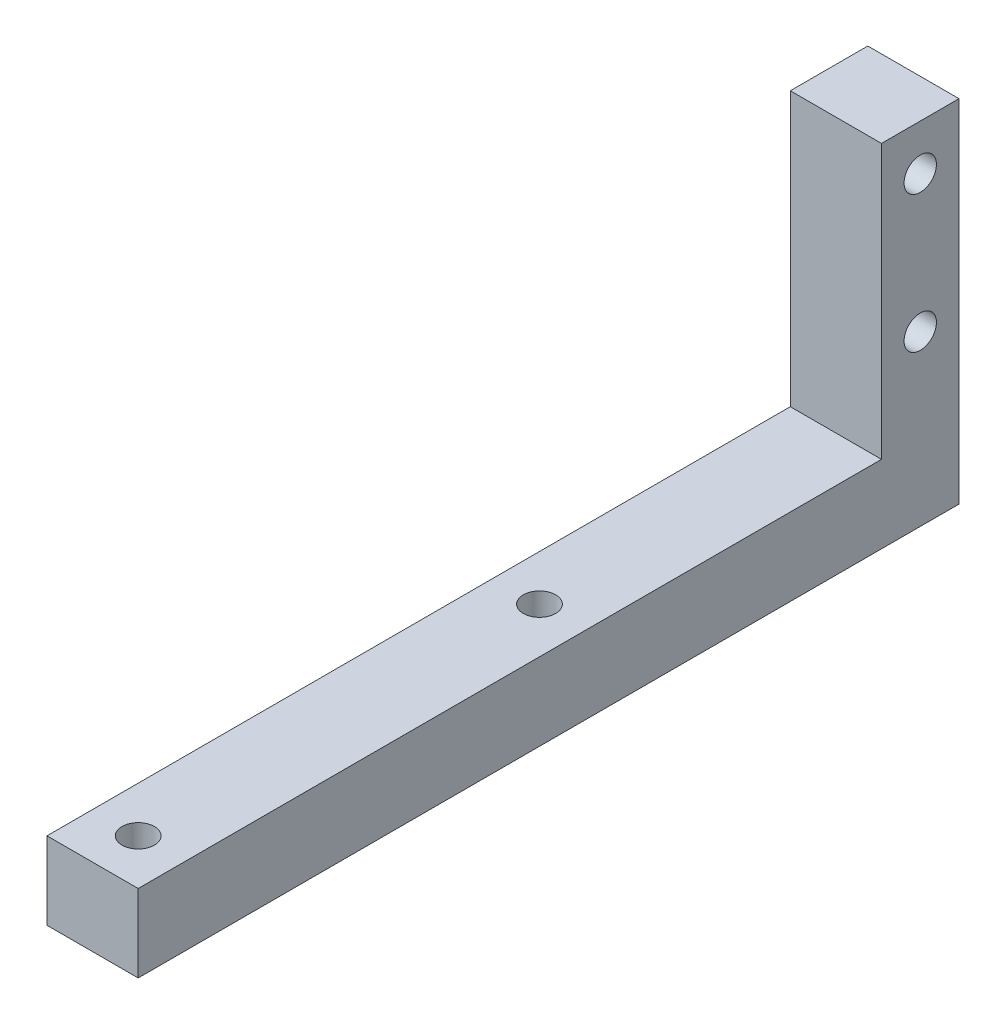
ISO-10303-21;
HEADER;
FILE_DESCRIPTION(('STEP AP214'),'2;1');
FILE_NAME('part.step','',(''),(''),'','','');
FILE_SCHEMA(('AUTOMOTIVE_DESIGN { 1 0 10303 214 1 1 1 1 }'));
ENDSEC;
DATA;
#1=APPLICATION_CONTEXT('core data for automotive mechanical design processes');
#2=APPLICATION_PROTOCOL_DEFINITION('international standard','automotive_design',2000,#1);
#3=PRODUCT_CONTEXT('',#1,'mechanical');
#4=PRODUCT('Part','Part','',(#3));
#5=PRODUCT_RELATED_PRODUCT_CATEGORY('part','',(#4));
#6=PRODUCT_DEFINITION_FORMATION('','',#4);
#7=PRODUCT_DEFINITION_CONTEXT('part definition',#1,'design');
#8=PRODUCT_DEFINITION('design','',#6,#7);
#9=PRODUCT_DEFINITION_SHAPE('','',#8);
#10=(LENGTH_UNIT() NAMED_UNIT(*) SI_UNIT(.MILLI.,.METRE.));
#11=(NAMED_UNIT(*) PLANE_ANGLE_UNIT() SI_UNIT($,.RADIAN.));
#12=(NAMED_UNIT(*) SI_UNIT($,.STERADIAN.) SOLID_ANGLE_UNIT());
#13=UNCERTAINTY_MEASURE_WITH_UNIT(LENGTH_MEASURE(1.E-05),#10,'distance_accuracy_value','');
#14=(GEOMETRIC_REPRESENTATION_CONTEXT(3) GLOBAL_UNCERTAINTY_ASSIGNED_CONTEXT((#13)) GLOBAL_UNIT_ASSIGNED_CONTEXT((#10,
#11,#12)) REPRESENTATION_CONTEXT('',''));
#15=CARTESIAN_POINT('',(0.,0.,0.));
#16=DIRECTION('',(0.,0.,1.));
#17=DIRECTION('',(1.,0.,0.));
#18=AXIS2_PLACEMENT_3D('',#15,#16,#17);
#19=CARTESIAN_POINT('',(10.,0.,0.));
#20=DIRECTION('',(-1.,0.,0.));
#21=DIRECTION('',(0.,0.,1.));
#22=AXIS2_PLACEMENT_3D('',#19,#20,#21);
#23=PLANE('',#22);
#24=CARTESIAN_POINT('',(10.,14.63527829693,-29.6569073284358));
#25=DIRECTION('',(1.,0.,0.));
#26=DIRECTION('',(0.,0.,-1.));
#27=AXIS2_PLACEMENT_3D('',#24,#25,#26);
#28=CIRCLE('',#27,1.77500000000001);
#29=CARTESIAN_POINT('',(10.,14.63527829693,-31.4319073284358));
#30=VERTEX_POINT('',#29);
#31=EDGE_CURVE('E121',#30,#30,#28,.T.);
#32=ORIENTED_EDGE('',*,*,#31,.F.);
#33=EDGE_LOOP('',(#32));
#34=FACE_BOUND('',#33,.T.);
#35=DIRECTION('',(0.,-1.,0.));
#36=VECTOR('',#35,1.);
#37=CARTESIAN_POINT('',(10.,-3.86472170306998,56.0930926715642));
#38=LINE('',#37,#36);
#39=CARTESIAN_POINT('',(10.,4.63527829693002,56.0930926715642));
#40=VERTEX_POINT('',#39);
#41=CARTESIAN_POINT('',(10.,-3.86472170306998,56.0930926715642));
#42=VERTEX_POINT('',#41);
#43=EDGE_CURVE('E128',#40,#42,#38,.T.);
#44=ORIENTED_EDGE('',*,*,#43,.T.);
#45=DIRECTION('',(0.,0.,-1.));
#46=VECTOR('',#45,1.);
#47=CARTESIAN_POINT('',(10.,-3.86472170306996,-33.9069073284358));
#48=LINE('',#47,#46);
#49=CARTESIAN_POINT('',(10.,-3.86472170306996,-33.9069073284358));
#50=VERTEX_POINT('',#49);
#51=EDGE_CURVE('E86',#42,#50,#48,.T.);
#52=ORIENTED_EDGE('',*,*,#51,.T.);
#53=DIRECTION('',(0.,1.,0.));
#54=VECTOR('',#53,1.);
#55=CARTESIAN_POINT('',(10.,34.63527829693,-33.9069073284358));
#56=LINE('',#55,#54);
#57=CARTESIAN_POINT('',(10.,34.63527829693,-33.9069073284358));
#58=VERTEX_POINT('',#57);
#59=EDGE_CURVE('E99',#50,#58,#56,.T.);
#60=ORIENTED_EDGE('',*,*,#59,.T.);
#61=DIRECTION('',(0.,0.,1.));
#62=VECTOR('',#61,1.);
#63=CARTESIAN_POINT('',(10.,34.63527829693,-25.4069073284358));
#64=LINE('',#63,#62);
#65=CARTESIAN_POINT('',(10.,34.63527829693,-25.4069073284358));
#66=VERTEX_POINT('',#65);
#67=EDGE_CURVE('E93',#58,#66,#64,.T.);
#68=ORIENTED_EDGE('',*,*,#67,.T.);
#69=DIRECTION('',(0.,-1.,0.));
#70=VECTOR('',#69,1.);
#71=CARTESIAN_POINT('',(10.,4.63527829693002,-25.4069073284358));
#72=LINE('',#71,#70);
#73=CARTESIAN_POINT('',(10.,4.63527829693002,-25.4069073284358));
#74=VERTEX_POINT('',#73);
#75=EDGE_CURVE('E97',#66,#74,#72,.T.);
#76=ORIENTED_EDGE('',*,*,#75,.T.);
#77=DIRECTION('',(0.,0.,1.));
#78=VECTOR('',#77,1.);
#79=CARTESIAN_POINT('',(10.,4.63527829693002,56.0930926715642));
#80=LINE('',#79,#78);
#81=EDGE_CURVE('E49',#74,#40,#80,.T.);
#82=ORIENTED_EDGE('',*,*,#81,.T.);
#83=EDGE_LOOP('',(#44,#52,#60,#68,#76,#82));
#84=FACE_BOUND('',#83,.T.);
#85=CARTESIAN_POINT('',(10.,29.63527829693,-29.6569073284358));
#86=DIRECTION('',(1.,0.,0.));
#87=DIRECTION('',(0.,0.,-1.));
#88=AXIS2_PLACEMENT_3D('',#85,#86,#87);
#89=CIRCLE('',#88,1.77500000000001);
#90=CARTESIAN_POINT('',(10.,29.63527829693,-31.4319073284358));
#91=VERTEX_POINT('',#90);
#92=EDGE_CURVE('E195',#91,#91,#89,.T.);
#93=ORIENTED_EDGE('',*,*,#92,.F.);
#94=EDGE_LOOP('',(#93));
#95=FACE_BOUND('',#94,.T.);
#96=ADVANCED_FACE('F32',(#34,#84,#95),#23,.F.);
#97=CARTESIAN_POINT('',(0.,0.,0.));
#98=DIRECTION('',(-1.,0.,0.));
#99=DIRECTION('',(0.,0.,1.));
#100=AXIS2_PLACEMENT_3D('',#97,#98,#99);
#101=PLANE('',#100);
#102=CARTESIAN_POINT('',(0.,14.63527829693,-29.6569073284358));
#103=DIRECTION('',(1.,0.,0.));
#104=DIRECTION('',(0.,0.,-1.));
#105=AXIS2_PLACEMENT_3D('',#102,#103,#104);
#106=CIRCLE('',#105,1.77500000000001);
#107=CARTESIAN_POINT('',(0.,14.63527829693,-31.4319073284358));
#108=VERTEX_POINT('',#107);
#109=EDGE_CURVE('E198',#108,#108,#106,.T.);
#110=ORIENTED_EDGE('',*,*,#109,.T.);
#111=EDGE_LOOP('',(#110));
#112=FACE_BOUND('',#111,.T.);
#113=DIRECTION('',(0.,-1.,0.));
#114=VECTOR('',#113,1.);
#115=CARTESIAN_POINT('',(0.,-3.86472170306998,56.0930926715642));
#116=LINE('',#115,#114);
#117=CARTESIAN_POINT('',(0.,4.63527829693002,56.0930926715642));
#118=VERTEX_POINT('',#117);
#119=CARTESIAN_POINT('',(0.,-3.86472170306998,56.0930926715642));
#120=VERTEX_POINT('',#119);
#121=EDGE_CURVE('E117',#118,#120,#116,.T.);
#122=ORIENTED_EDGE('',*,*,#121,.F.);
#123=DIRECTION('',(0.,0.,1.));
#124=VECTOR('',#123,1.);
#125=CARTESIAN_POINT('',(0.,4.63527829693002,56.0930926715642));
#126=LINE('',#125,#124);
#127=CARTESIAN_POINT('',(0.,4.63527829693002,-25.4069073284358));
#128=VERTEX_POINT('',#127);
#129=EDGE_CURVE('E78',#128,#118,#126,.T.);
#130=ORIENTED_EDGE('',*,*,#129,.F.);
#131=DIRECTION('',(0.,-1.,0.));
#132=VECTOR('',#131,1.);
#133=CARTESIAN_POINT('',(0.,4.63527829693002,-25.4069073284358));
#134=LINE('',#133,#132);
#135=CARTESIAN_POINT('',(0.,34.63527829693,-25.4069073284358));
#136=VERTEX_POINT('',#135);
#137=EDGE_CURVE('E72',#136,#128,#134,.T.);
#138=ORIENTED_EDGE('',*,*,#137,.F.);
#139=DIRECTION('',(0.,0.,1.));
#140=VECTOR('',#139,1.);
#141=CARTESIAN_POINT('',(0.,34.63527829693,-25.4069073284358));
#142=LINE('',#141,#140);
#143=CARTESIAN_POINT('',(0.,34.63527829693,-33.9069073284358));
#144=VERTEX_POINT('',#143);
#145=EDGE_CURVE('E107',#144,#136,#142,.T.);
#146=ORIENTED_EDGE('',*,*,#145,.F.);
#147=DIRECTION('',(0.,1.,0.));
#148=VECTOR('',#147,1.);
#149=CARTESIAN_POINT('',(0.,34.63527829693,-33.9069073284358));
#150=LINE('',#149,#148);
#151=CARTESIAN_POINT('',(0.,-3.86472170306996,-33.9069073284358));
#152=VERTEX_POINT('',#151);
#153=EDGE_CURVE('E123',#152,#144,#150,.T.);
#154=ORIENTED_EDGE('',*,*,#153,.F.);
#155=DIRECTION('',(0.,0.,-1.));
#156=VECTOR('',#155,1.);
#157=CARTESIAN_POINT('',(0.,-3.86472170306996,-33.9069073284358));
#158=LINE('',#157,#156);
#159=EDGE_CURVE('E120',#120,#152,#158,.T.);
#160=ORIENTED_EDGE('',*,*,#159,.F.);
#161=EDGE_LOOP('',(#122,#130,#138,#146,#154,#160));
#162=FACE_BOUND('',#161,.T.);
#163=CARTESIAN_POINT('',(0.,29.63527829693,-29.6569073284358));
#164=DIRECTION('',(1.,0.,0.));
#165=DIRECTION('',(0.,0.,-1.));
#166=AXIS2_PLACEMENT_3D('',#163,#164,#165);
#167=CIRCLE('',#166,1.77500000000001);
#168=CARTESIAN_POINT('',(0.,29.63527829693,-31.4319073284358));
#169=VERTEX_POINT('',#168);
#170=EDGE_CURVE('E192',#169,#169,#167,.T.);
#171=ORIENTED_EDGE('',*,*,#170,.T.);
#172=EDGE_LOOP('',(#171));
#173=FACE_BOUND('',#172,.T.);
#174=ADVANCED_FACE('F137',(#112,#162,#173),#101,.T.);
#175=CARTESIAN_POINT('',(10.,-3.86472170306998,56.0930926715642));
#176=DIRECTION('',(0.,0.,-1.));
#177=DIRECTION('',(-1.,0.,0.));
#178=AXIS2_PLACEMENT_3D('',#175,#176,#177);
#179=PLANE('',#178);
#180=ORIENTED_EDGE('',*,*,#121,.T.);
#181=DIRECTION('',(-1.,0.,0.));
#182=VECTOR('',#181,1.);
#183=CARTESIAN_POINT('',(10.,-3.86472170306998,56.0930926715642));
#184=LINE('',#183,#182);
#185=EDGE_CURVE('E11',#42,#120,#184,.T.);
#186=ORIENTED_EDGE('',*,*,#185,.F.);
#187=ORIENTED_EDGE('',*,*,#43,.F.);
#188=DIRECTION('',(-1.,0.,0.));
#189=VECTOR('',#188,1.);
#190=CARTESIAN_POINT('',(10.,4.63527829693002,56.0930926715642));
#191=LINE('',#190,#189);
#192=EDGE_CURVE('E113',#40,#118,#191,.T.);
#193=ORIENTED_EDGE('',*,*,#192,.T.);
#194=EDGE_LOOP('',(#180,#186,#187,#193));
#195=FACE_BOUND('',#194,.T.);
#196=ADVANCED_FACE('F34',(#195),#179,.F.);
#197=CARTESIAN_POINT('',(10.,-3.86472170306996,-33.9069073284358));
#198=DIRECTION('',(0.,1.,0.));
#199=DIRECTION('',(0.,0.,1.));
#200=AXIS2_PLACEMENT_3D('',#197,#198,#199);
#201=PLANE('',#200);
#202=CARTESIAN_POINT('',(5.,-3.86472170306998,7.09309267156424));
#203=DIRECTION('',(0.,1.,0.));
#204=DIRECTION('',(0.,0.,1.));
#205=AXIS2_PLACEMENT_3D('',#202,#203,#204);
#206=CIRCLE('',#205,1.775);
#207=CARTESIAN_POINT('',(5.,-3.86472170306998,8.86809267156424));
#208=VERTEX_POINT('',#207);
#209=EDGE_CURVE('E182',#208,#208,#206,.T.);
#210=ORIENTED_EDGE('',*,*,#209,.T.);
#211=EDGE_LOOP('',(#210));
#212=FACE_BOUND('',#211,.T.);
#213=CARTESIAN_POINT('',(5.,-3.86472170306998,51.0930926715642));
#214=DIRECTION('',(0.,1.,0.));
#215=DIRECTION('',(0.,0.,1.));
#216=AXIS2_PLACEMENT_3D('',#213,#214,#215);
#217=CIRCLE('',#216,1.775);
#218=CARTESIAN_POINT('',(5.,-3.86472170306998,52.8680926715642));
#219=VERTEX_POINT('',#218);
#220=EDGE_CURVE('E189',#219,#219,#217,.T.);
#221=ORIENTED_EDGE('',*,*,#220,.T.);
#222=EDGE_LOOP('',(#221));
#223=FACE_BOUND('',#222,.T.);
#224=ORIENTED_EDGE('',*,*,#159,.T.);
#225=DIRECTION('',(-1.,0.,0.));
#226=VECTOR('',#225,1.);
#227=CARTESIAN_POINT('',(10.,-3.86472170306996,-33.9069073284358));
#228=LINE('',#227,#226);
#229=EDGE_CURVE('E41',#50,#152,#228,.T.);
#230=ORIENTED_EDGE('',*,*,#229,.F.);
#231=ORIENTED_EDGE('',*,*,#51,.F.);
#232=ORIENTED_EDGE('',*,*,#185,.T.);
#233=EDGE_LOOP('',(#224,#230,#231,#232));
#234=FACE_BOUND('',#233,.T.);
#235=ADVANCED_FACE('F215',(#212,#223,#234),#201,.F.);
#236=CARTESIAN_POINT('',(10.,34.63527829693,-33.9069073284358));
#237=DIRECTION('',(0.,0.,1.));
#238=DIRECTION('',(0.,-1.,0.));
#239=AXIS2_PLACEMENT_3D('',#236,#237,#238);
#240=PLANE('',#239);
#241=ORIENTED_EDGE('',*,*,#153,.T.);
#242=DIRECTION('',(-1.,0.,0.));
#243=VECTOR('',#242,1.);
#244=CARTESIAN_POINT('',(10.,34.63527829693,-33.9069073284358));
#245=LINE('',#244,#243);
#246=EDGE_CURVE('E108',#58,#144,#245,.T.);
#247=ORIENTED_EDGE('',*,*,#246,.F.);
#248=ORIENTED_EDGE('',*,*,#59,.F.);
#249=ORIENTED_EDGE('',*,*,#229,.T.);
#250=EDGE_LOOP('',(#241,#247,#248,#249));
#251=FACE_BOUND('',#250,.T.);
#252=ADVANCED_FACE('F134',(#251),#240,.F.);
#253=CARTESIAN_POINT('',(10.,34.63527829693,-25.4069073284358));
#254=DIRECTION('',(0.,-1.,0.));
#255=DIRECTION('',(0.,0.,-1.));
#256=AXIS2_PLACEMENT_3D('',#253,#254,#255);
#257=PLANE('',#256);
#258=ORIENTED_EDGE('',*,*,#145,.T.);
#259=DIRECTION('',(-1.,0.,0.));
#260=VECTOR('',#259,1.);
#261=CARTESIAN_POINT('',(10.,34.63527829693,-25.4069073284358));
#262=LINE('',#261,#260);
#263=EDGE_CURVE('E104',#66,#136,#262,.T.);
#264=ORIENTED_EDGE('',*,*,#263,.F.);
#265=ORIENTED_EDGE('',*,*,#67,.F.);
#266=ORIENTED_EDGE('',*,*,#246,.T.);
#267=EDGE_LOOP('',(#258,#264,#265,#266));
#268=FACE_BOUND('',#267,.T.);
#269=ADVANCED_FACE('F105',(#268),#257,.F.);
#270=CARTESIAN_POINT('',(10.,4.63527829693002,-25.4069073284358));
#271=DIRECTION('',(0.,0.,-1.));
#272=DIRECTION('',(0.,1.,0.));
#273=AXIS2_PLACEMENT_3D('',#270,#271,#272);
#274=PLANE('',#273);
#275=ORIENTED_EDGE('',*,*,#137,.T.);
#276=DIRECTION('',(-1.,0.,0.));
#277=VECTOR('',#276,1.);
#278=CARTESIAN_POINT('',(10.,4.63527829693002,-25.4069073284358));
#279=LINE('',#278,#277);
#280=EDGE_CURVE('E109',#74,#128,#279,.T.);
#281=ORIENTED_EDGE('',*,*,#280,.F.);
#282=ORIENTED_EDGE('',*,*,#75,.F.);
#283=ORIENTED_EDGE('',*,*,#263,.T.);
#284=EDGE_LOOP('',(#275,#281,#282,#283));
#285=FACE_BOUND('',#284,.T.);
#286=ADVANCED_FACE('F111',(#285),#274,.F.);
#287=CARTESIAN_POINT('',(10.,4.63527829693002,56.0930926715642));
#288=DIRECTION('',(0.,-1.,0.));
#289=DIRECTION('',(0.,0.,-1.));
#290=AXIS2_PLACEMENT_3D('',#287,#288,#289);
#291=PLANE('',#290);
#292=CARTESIAN_POINT('',(5.,4.63527829693002,7.09309267156424));
#293=DIRECTION('',(0.,1.,0.));
#294=DIRECTION('',(0.,0.,1.));
#295=AXIS2_PLACEMENT_3D('',#292,#293,#294);
#296=CIRCLE('',#295,1.775);
#297=CARTESIAN_POINT('',(5.,4.63527829693002,8.86809267156424));
#298=VERTEX_POINT('',#297);
#299=EDGE_CURVE('E184',#298,#298,#296,.T.);
#300=ORIENTED_EDGE('',*,*,#299,.F.);
#301=EDGE_LOOP('',(#300));
#302=FACE_BOUND('',#301,.T.);
#303=CARTESIAN_POINT('',(5.,4.63527829693003,51.0930926715642));
#304=DIRECTION('',(0.,1.,0.));
#305=DIRECTION('',(0.,0.,1.));
#306=AXIS2_PLACEMENT_3D('',#303,#304,#305);
#307=CIRCLE('',#306,1.775);
#308=CARTESIAN_POINT('',(5.,4.63527829693003,52.8680926715642));
#309=VERTEX_POINT('',#308);
#310=EDGE_CURVE('E186',#309,#309,#307,.T.);
#311=ORIENTED_EDGE('',*,*,#310,.F.);
#312=EDGE_LOOP('',(#311));
#313=FACE_BOUND('',#312,.T.);
#314=ORIENTED_EDGE('',*,*,#129,.T.);
#315=ORIENTED_EDGE('',*,*,#192,.F.);
#316=ORIENTED_EDGE('',*,*,#81,.F.);
#317=ORIENTED_EDGE('',*,*,#280,.T.);
#318=EDGE_LOOP('',(#314,#315,#316,#317));
#319=FACE_BOUND('',#318,.T.);
#320=ADVANCED_FACE('F142',(#302,#313,#319),#291,.F.);
#321=CARTESIAN_POINT('',(10.,14.63527829693,-29.6569073284358));
#322=DIRECTION('',(-1.,0.,0.));
#323=DIRECTION('',(0.,0.,1.));
#324=AXIS2_PLACEMENT_3D('',#321,#322,#323);
#325=CYLINDRICAL_SURFACE('',#324,1.77500000000001);
#326=ORIENTED_EDGE('',*,*,#31,.T.);
#327=EDGE_LOOP('',(#326));
#328=FACE_BOUND('',#327,.T.);
#329=ORIENTED_EDGE('',*,*,#109,.F.);
#330=EDGE_LOOP('',(#329));
#331=FACE_BOUND('',#330,.T.);
#332=ADVANCED_FACE('F144',(#328,#331),#325,.F.);
#333=CARTESIAN_POINT('',(10.,29.63527829693,-29.6569073284358));
#334=DIRECTION('',(-1.,0.,0.));
#335=DIRECTION('',(0.,0.,1.));
#336=AXIS2_PLACEMENT_3D('',#333,#334,#335);
#337=CYLINDRICAL_SURFACE('',#336,1.77500000000001);
#338=ORIENTED_EDGE('',*,*,#92,.T.);
#339=EDGE_LOOP('',(#338));
#340=FACE_BOUND('',#339,.T.);
#341=ORIENTED_EDGE('',*,*,#170,.F.);
#342=EDGE_LOOP('',(#341));
#343=FACE_BOUND('',#342,.T.);
#344=ADVANCED_FACE('F151',(#340,#343),#337,.F.);
#345=CARTESIAN_POINT('',(5.,-3.86472170306998,51.0930926715642));
#346=DIRECTION('',(0.,1.,0.));
#347=DIRECTION('',(0.,0.,1.));
#348=AXIS2_PLACEMENT_3D('',#345,#346,#347);
#349=CYLINDRICAL_SURFACE('',#348,1.775);
#350=ORIENTED_EDGE('',*,*,#220,.F.);
#351=EDGE_LOOP('',(#350));
#352=FACE_BOUND('',#351,.T.);
#353=ORIENTED_EDGE('',*,*,#310,.T.);
#354=EDGE_LOOP('',(#353));
#355=FACE_BOUND('',#354,.T.);
#356=ADVANCED_FACE('F169',(#352,#355),#349,.F.);
#357=CARTESIAN_POINT('',(5.,-3.86472170306998,7.09309267156424));
#358=DIRECTION('',(0.,1.,0.));
#359=DIRECTION('',(0.,0.,1.));
#360=AXIS2_PLACEMENT_3D('',#357,#358,#359);
#361=CYLINDRICAL_SURFACE('',#360,1.775);
#362=ORIENTED_EDGE('',*,*,#209,.F.);
#363=EDGE_LOOP('',(#362));
#364=FACE_BOUND('',#363,.T.);
#365=ORIENTED_EDGE('',*,*,#299,.T.);
#366=EDGE_LOOP('',(#365));
#367=FACE_BOUND('',#366,.T.);
#368=ADVANCED_FACE('F173',(#364,#367),#361,.F.);
#369=CLOSED_SHELL('',(#96,#174,#196,#235,#252,#269,#286,#320,#332,#344,#356,#368));
#370=MANIFOLD_SOLID_BREP('B2',#369);
#371=ADVANCED_BREP_SHAPE_REPRESENTATION('',(#18,#370),#14);
#372=SHAPE_DEFINITION_REPRESENTATION(#9,#371);
ENDSEC;
END-ISO-10303-21;
